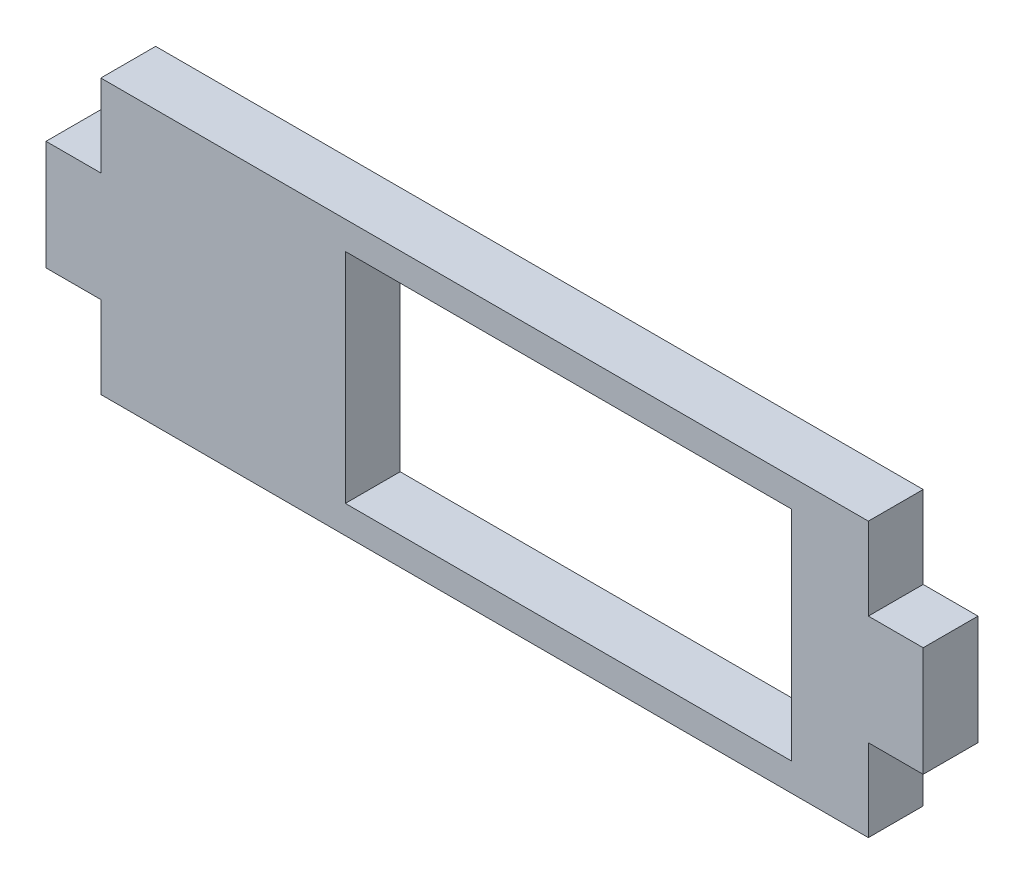
ISO-10303-21;
HEADER;
FILE_DESCRIPTION(('STEP AP214'),'2;1');
FILE_NAME('part.step','',(''),(''),'','','');
FILE_SCHEMA(('AUTOMOTIVE_DESIGN { 1 0 10303 214 1 1 1 1 }'));
ENDSEC;
DATA;
#1=APPLICATION_CONTEXT('core data for automotive mechanical design processes');
#2=APPLICATION_PROTOCOL_DEFINITION('international standard','automotive_design',2000,#1);
#3=PRODUCT_CONTEXT('',#1,'mechanical');
#4=PRODUCT('Part','Part','',(#3));
#5=PRODUCT_RELATED_PRODUCT_CATEGORY('part','',(#4));
#6=PRODUCT_DEFINITION_FORMATION('','',#4);
#7=PRODUCT_DEFINITION_CONTEXT('part definition',#1,'design');
#8=PRODUCT_DEFINITION('design','',#6,#7);
#9=PRODUCT_DEFINITION_SHAPE('','',#8);
#10=(LENGTH_UNIT() NAMED_UNIT(*) SI_UNIT(.MILLI.,.METRE.));
#11=(NAMED_UNIT(*) PLANE_ANGLE_UNIT() SI_UNIT($,.RADIAN.));
#12=(NAMED_UNIT(*) SI_UNIT($,.STERADIAN.) SOLID_ANGLE_UNIT());
#13=UNCERTAINTY_MEASURE_WITH_UNIT(LENGTH_MEASURE(1.E-05),#10,'distance_accuracy_value','');
#14=(GEOMETRIC_REPRESENTATION_CONTEXT(3) GLOBAL_UNCERTAINTY_ASSIGNED_CONTEXT((#13)) GLOBAL_UNIT_ASSIGNED_CONTEXT((#10,
#11,#12)) REPRESENTATION_CONTEXT('',''));
#15=CARTESIAN_POINT('',(0.,0.,0.));
#16=DIRECTION('',(0.,0.,1.));
#17=DIRECTION('',(1.,0.,0.));
#18=AXIS2_PLACEMENT_3D('',#15,#16,#17);
#19=CARTESIAN_POINT('',(35.,0.,5.));
#20=DIRECTION('',(1.,0.,0.));
#21=DIRECTION('',(0.,1.,0.));
#22=AXIS2_PLACEMENT_3D('',#19,#20,#21);
#23=PLANE('',#22);
#24=DIRECTION('',(0.,-1.,0.));
#25=VECTOR('',#24,1.);
#26=CARTESIAN_POINT('',(35.,0.,0.));
#27=LINE('',#26,#25);
#28=CARTESIAN_POINT('',(35.,-5.,0.));
#29=VERTEX_POINT('',#28);
#30=CARTESIAN_POINT('',(35.,-12.5,0.));
#31=VERTEX_POINT('',#30);
#32=EDGE_CURVE('E178',#29,#31,#27,.T.);
#33=ORIENTED_EDGE('',*,*,#32,.F.);
#34=DIRECTION('',(0.,0.,-1.));
#35=VECTOR('',#34,1.);
#36=CARTESIAN_POINT('',(35.,-5.,5.));
#37=LINE('',#36,#35);
#38=CARTESIAN_POINT('',(35.,-5.,5.));
#39=VERTEX_POINT('',#38);
#40=EDGE_CURVE('E11',#39,#29,#37,.T.);
#41=ORIENTED_EDGE('',*,*,#40,.F.);
#42=DIRECTION('',(0.,-1.,0.));
#43=VECTOR('',#42,1.);
#44=CARTESIAN_POINT('',(35.,0.,5.));
#45=LINE('',#44,#43);
#46=CARTESIAN_POINT('',(35.,-12.5,5.));
#47=VERTEX_POINT('',#46);
#48=EDGE_CURVE('E182',#39,#47,#45,.T.);
#49=ORIENTED_EDGE('',*,*,#48,.T.);
#50=DIRECTION('',(0.,0.,-1.));
#51=VECTOR('',#50,1.);
#52=CARTESIAN_POINT('',(35.,-12.5,5.));
#53=LINE('',#52,#51);
#54=EDGE_CURVE('E213',#47,#31,#53,.T.);
#55=ORIENTED_EDGE('',*,*,#54,.T.);
#56=EDGE_LOOP('',(#33,#41,#49,#55));
#57=FACE_BOUND('',#56,.T.);
#58=ADVANCED_FACE('F34',(#57),#23,.T.);
#59=CARTESIAN_POINT('',(0.,-5.00000000000001,5.));
#60=DIRECTION('',(0.,-1.,0.));
#61=DIRECTION('',(1.,0.,0.));
#62=AXIS2_PLACEMENT_3D('',#59,#60,#61);
#63=PLANE('',#62);
#64=DIRECTION('',(-1.,0.,0.));
#65=VECTOR('',#64,1.);
#66=CARTESIAN_POINT('',(0.,-5.00000000000001,0.));
#67=LINE('',#66,#65);
#68=CARTESIAN_POINT('',(40.,-5.,0.));
#69=VERTEX_POINT('',#68);
#70=EDGE_CURVE('E216',#69,#29,#67,.T.);
#71=ORIENTED_EDGE('',*,*,#70,.F.);
#72=DIRECTION('',(0.,0.,-1.));
#73=VECTOR('',#72,1.);
#74=CARTESIAN_POINT('',(40.,-5.,5.));
#75=LINE('',#74,#73);
#76=CARTESIAN_POINT('',(40.,-5.,5.));
#77=VERTEX_POINT('',#76);
#78=EDGE_CURVE('E41',#77,#69,#75,.T.);
#79=ORIENTED_EDGE('',*,*,#78,.F.);
#80=DIRECTION('',(-1.,0.,0.));
#81=VECTOR('',#80,1.);
#82=CARTESIAN_POINT('',(0.,-5.00000000000001,5.));
#83=LINE('',#82,#81);
#84=EDGE_CURVE('E185',#77,#39,#83,.T.);
#85=ORIENTED_EDGE('',*,*,#84,.T.);
#86=ORIENTED_EDGE('',*,*,#40,.T.);
#87=EDGE_LOOP('',(#71,#79,#85,#86));
#88=FACE_BOUND('',#87,.T.);
#89=ADVANCED_FACE('F273',(#88),#63,.T.);
#90=CARTESIAN_POINT('',(40.,0.,5.));
#91=DIRECTION('',(1.,0.,0.));
#92=DIRECTION('',(0.,0.,-1.));
#93=AXIS2_PLACEMENT_3D('',#90,#91,#92);
#94=PLANE('',#93);
#95=DIRECTION('',(0.,-1.,0.));
#96=VECTOR('',#95,1.);
#97=CARTESIAN_POINT('',(40.,0.,0.));
#98=LINE('',#97,#96);
#99=CARTESIAN_POINT('',(40.,5.,0.));
#100=VERTEX_POINT('',#99);
#101=EDGE_CURVE('E219',#100,#69,#98,.T.);
#102=ORIENTED_EDGE('',*,*,#101,.F.);
#103=DIRECTION('',(0.,0.,-1.));
#104=VECTOR('',#103,1.);
#105=CARTESIAN_POINT('',(40.,5.,5.));
#106=LINE('',#105,#104);
#107=CARTESIAN_POINT('',(40.,5.,5.));
#108=VERTEX_POINT('',#107);
#109=EDGE_CURVE('E265',#108,#100,#106,.T.);
#110=ORIENTED_EDGE('',*,*,#109,.F.);
#111=DIRECTION('',(0.,-1.,0.));
#112=VECTOR('',#111,1.);
#113=CARTESIAN_POINT('',(40.,0.,5.));
#114=LINE('',#113,#112);
#115=EDGE_CURVE('E189',#108,#77,#114,.T.);
#116=ORIENTED_EDGE('',*,*,#115,.T.);
#117=ORIENTED_EDGE('',*,*,#78,.T.);
#118=EDGE_LOOP('',(#102,#110,#116,#117));
#119=FACE_BOUND('',#118,.T.);
#120=ADVANCED_FACE('F269',(#119),#94,.T.);
#121=CARTESIAN_POINT('',(0.,5.,5.));
#122=DIRECTION('',(0.,-1.,0.));
#123=DIRECTION('',(0.,0.,-1.));
#124=AXIS2_PLACEMENT_3D('',#121,#122,#123);
#125=PLANE('',#124);
#126=DIRECTION('',(-1.,0.,0.));
#127=VECTOR('',#126,1.);
#128=CARTESIAN_POINT('',(0.,5.,0.));
#129=LINE('',#128,#127);
#130=CARTESIAN_POINT('',(35.,5.,0.));
#131=VERTEX_POINT('',#130);
#132=EDGE_CURVE('E222',#100,#131,#129,.T.);
#133=ORIENTED_EDGE('',*,*,#132,.T.);
#134=DIRECTION('',(0.,0.,-1.));
#135=VECTOR('',#134,1.);
#136=CARTESIAN_POINT('',(35.,5.,5.));
#137=LINE('',#136,#135);
#138=CARTESIAN_POINT('',(35.,5.,5.));
#139=VERTEX_POINT('',#138);
#140=EDGE_CURVE('E263',#139,#131,#137,.T.);
#141=ORIENTED_EDGE('',*,*,#140,.F.);
#142=DIRECTION('',(-1.,0.,0.));
#143=VECTOR('',#142,1.);
#144=CARTESIAN_POINT('',(0.,5.,5.));
#145=LINE('',#144,#143);
#146=EDGE_CURVE('E192',#108,#139,#145,.T.);
#147=ORIENTED_EDGE('',*,*,#146,.F.);
#148=ORIENTED_EDGE('',*,*,#109,.T.);
#149=EDGE_LOOP('',(#133,#141,#147,#148));
#150=FACE_BOUND('',#149,.T.);
#151=ADVANCED_FACE('F279',(#150),#125,.F.);
#152=CARTESIAN_POINT('',(35.,0.,5.));
#153=DIRECTION('',(1.,0.,0.));
#154=DIRECTION('',(0.,1.,0.));
#155=AXIS2_PLACEMENT_3D('',#152,#153,#154);
#156=PLANE('',#155);
#157=DIRECTION('',(0.,-1.,0.));
#158=VECTOR('',#157,1.);
#159=CARTESIAN_POINT('',(35.,0.,0.));
#160=LINE('',#159,#158);
#161=CARTESIAN_POINT('',(35.,12.5,0.));
#162=VERTEX_POINT('',#161);
#163=EDGE_CURVE('E225',#162,#131,#160,.T.);
#164=ORIENTED_EDGE('',*,*,#163,.F.);
#165=DIRECTION('',(0.,0.,-1.));
#166=VECTOR('',#165,1.);
#167=CARTESIAN_POINT('',(35.,12.5,5.));
#168=LINE('',#167,#166);
#169=CARTESIAN_POINT('',(35.,12.5,5.));
#170=VERTEX_POINT('',#169);
#171=EDGE_CURVE('E261',#170,#162,#168,.T.);
#172=ORIENTED_EDGE('',*,*,#171,.F.);
#173=DIRECTION('',(0.,-1.,0.));
#174=VECTOR('',#173,1.);
#175=CARTESIAN_POINT('',(35.,0.,5.));
#176=LINE('',#175,#174);
#177=EDGE_CURVE('E194',#170,#139,#176,.T.);
#178=ORIENTED_EDGE('',*,*,#177,.T.);
#179=ORIENTED_EDGE('',*,*,#140,.T.);
#180=EDGE_LOOP('',(#164,#172,#178,#179));
#181=FACE_BOUND('',#180,.T.);
#182=ADVANCED_FACE('F319',(#181),#156,.T.);
#183=CARTESIAN_POINT('',(0.,12.5,5.));
#184=DIRECTION('',(0.,1.,0.));
#185=DIRECTION('',(0.,0.,1.));
#186=AXIS2_PLACEMENT_3D('',#183,#184,#185);
#187=PLANE('',#186);
#188=DIRECTION('',(1.,0.,0.));
#189=VECTOR('',#188,1.);
#190=CARTESIAN_POINT('',(0.,12.5,0.));
#191=LINE('',#190,#189);
#192=CARTESIAN_POINT('',(-35.,12.5,0.));
#193=VERTEX_POINT('',#192);
#194=EDGE_CURVE('E228',#193,#162,#191,.T.);
#195=ORIENTED_EDGE('',*,*,#194,.F.);
#196=DIRECTION('',(0.,0.,-1.));
#197=VECTOR('',#196,1.);
#198=CARTESIAN_POINT('',(-35.,12.5,5.));
#199=LINE('',#198,#197);
#200=CARTESIAN_POINT('',(-35.,12.5,5.));
#201=VERTEX_POINT('',#200);
#202=EDGE_CURVE('E259',#201,#193,#199,.T.);
#203=ORIENTED_EDGE('',*,*,#202,.F.);
#204=DIRECTION('',(1.,0.,0.));
#205=VECTOR('',#204,1.);
#206=CARTESIAN_POINT('',(0.,12.5,5.));
#207=LINE('',#206,#205);
#208=EDGE_CURVE('E197',#201,#170,#207,.T.);
#209=ORIENTED_EDGE('',*,*,#208,.T.);
#210=ORIENTED_EDGE('',*,*,#171,.T.);
#211=EDGE_LOOP('',(#195,#203,#209,#210));
#212=FACE_BOUND('',#211,.T.);
#213=ADVANCED_FACE('F316',(#212),#187,.T.);
#214=CARTESIAN_POINT('',(-35.,0.,5.));
#215=DIRECTION('',(1.,0.,0.));
#216=DIRECTION('',(0.,0.,-1.));
#217=AXIS2_PLACEMENT_3D('',#214,#215,#216);
#218=PLANE('',#217);
#219=DIRECTION('',(0.,-1.,0.));
#220=VECTOR('',#219,1.);
#221=CARTESIAN_POINT('',(-35.,0.,0.));
#222=LINE('',#221,#220);
#223=CARTESIAN_POINT('',(-35.,5.,0.));
#224=VERTEX_POINT('',#223);
#225=EDGE_CURVE('E231',#193,#224,#222,.T.);
#226=ORIENTED_EDGE('',*,*,#225,.T.);
#227=DIRECTION('',(0.,0.,-1.));
#228=VECTOR('',#227,1.);
#229=CARTESIAN_POINT('',(-35.,5.,5.));
#230=LINE('',#229,#228);
#231=CARTESIAN_POINT('',(-35.,5.,5.));
#232=VERTEX_POINT('',#231);
#233=EDGE_CURVE('E257',#232,#224,#230,.T.);
#234=ORIENTED_EDGE('',*,*,#233,.F.);
#235=DIRECTION('',(0.,-1.,0.));
#236=VECTOR('',#235,1.);
#237=CARTESIAN_POINT('',(-35.,0.,5.));
#238=LINE('',#237,#236);
#239=EDGE_CURVE('E200',#201,#232,#238,.T.);
#240=ORIENTED_EDGE('',*,*,#239,.F.);
#241=ORIENTED_EDGE('',*,*,#202,.T.);
#242=EDGE_LOOP('',(#226,#234,#240,#241));
#243=FACE_BOUND('',#242,.T.);
#244=ADVANCED_FACE('F313',(#243),#218,.F.);
#245=CARTESIAN_POINT('',(0.,5.,5.));
#246=DIRECTION('',(0.,1.,0.));
#247=DIRECTION('',(0.,0.,1.));
#248=AXIS2_PLACEMENT_3D('',#245,#246,#247);
#249=PLANE('',#248);
#250=DIRECTION('',(1.,0.,0.));
#251=VECTOR('',#250,1.);
#252=CARTESIAN_POINT('',(0.,5.,0.));
#253=LINE('',#252,#251);
#254=CARTESIAN_POINT('',(-40.,5.,0.));
#255=VERTEX_POINT('',#254);
#256=EDGE_CURVE('E234',#255,#224,#253,.T.);
#257=ORIENTED_EDGE('',*,*,#256,.F.);
#258=DIRECTION('',(0.,0.,-1.));
#259=VECTOR('',#258,1.);
#260=CARTESIAN_POINT('',(-40.,5.,5.));
#261=LINE('',#260,#259);
#262=CARTESIAN_POINT('',(-40.,5.,5.));
#263=VERTEX_POINT('',#262);
#264=EDGE_CURVE('E255',#263,#255,#261,.T.);
#265=ORIENTED_EDGE('',*,*,#264,.F.);
#266=DIRECTION('',(1.,0.,0.));
#267=VECTOR('',#266,1.);
#268=CARTESIAN_POINT('',(0.,5.,5.));
#269=LINE('',#268,#267);
#270=EDGE_CURVE('E202',#263,#232,#269,.T.);
#271=ORIENTED_EDGE('',*,*,#270,.T.);
#272=ORIENTED_EDGE('',*,*,#233,.T.);
#273=EDGE_LOOP('',(#257,#265,#271,#272));
#274=FACE_BOUND('',#273,.T.);
#275=ADVANCED_FACE('F307',(#274),#249,.T.);
#276=CARTESIAN_POINT('',(-40.,0.,5.));
#277=DIRECTION('',(1.,0.,0.));
#278=DIRECTION('',(0.,0.,-1.));
#279=AXIS2_PLACEMENT_3D('',#276,#277,#278);
#280=PLANE('',#279);
#281=DIRECTION('',(0.,-1.,0.));
#282=VECTOR('',#281,1.);
#283=CARTESIAN_POINT('',(-40.,0.,0.));
#284=LINE('',#283,#282);
#285=CARTESIAN_POINT('',(-40.,-5.,0.));
#286=VERTEX_POINT('',#285);
#287=EDGE_CURVE('E237',#255,#286,#284,.T.);
#288=ORIENTED_EDGE('',*,*,#287,.T.);
#289=DIRECTION('',(0.,0.,-1.));
#290=VECTOR('',#289,1.);
#291=CARTESIAN_POINT('',(-40.,-5.,5.));
#292=LINE('',#291,#290);
#293=CARTESIAN_POINT('',(-40.,-5.,5.));
#294=VERTEX_POINT('',#293);
#295=EDGE_CURVE('E252',#294,#286,#292,.T.);
#296=ORIENTED_EDGE('',*,*,#295,.F.);
#297=DIRECTION('',(0.,-1.,0.));
#298=VECTOR('',#297,1.);
#299=CARTESIAN_POINT('',(-40.,0.,5.));
#300=LINE('',#299,#298);
#301=EDGE_CURVE('E205',#263,#294,#300,.T.);
#302=ORIENTED_EDGE('',*,*,#301,.F.);
#303=ORIENTED_EDGE('',*,*,#264,.T.);
#304=EDGE_LOOP('',(#288,#296,#302,#303));
#305=FACE_BOUND('',#304,.T.);
#306=ADVANCED_FACE('F320',(#305),#280,.F.);
#307=CARTESIAN_POINT('',(0.,-5.00000000000001,5.));
#308=DIRECTION('',(0.,1.,0.));
#309=DIRECTION('',(-1.,0.,0.));
#310=AXIS2_PLACEMENT_3D('',#307,#308,#309);
#311=PLANE('',#310);
#312=DIRECTION('',(1.,0.,0.));
#313=VECTOR('',#312,1.);
#314=CARTESIAN_POINT('',(0.,-5.00000000000001,0.));
#315=LINE('',#314,#313);
#316=CARTESIAN_POINT('',(-35.,-5.,0.));
#317=VERTEX_POINT('',#316);
#318=EDGE_CURVE('E239',#286,#317,#315,.T.);
#319=ORIENTED_EDGE('',*,*,#318,.T.);
#320=DIRECTION('',(0.,0.,-1.));
#321=VECTOR('',#320,1.);
#322=CARTESIAN_POINT('',(-35.,-5.,5.));
#323=LINE('',#322,#321);
#324=CARTESIAN_POINT('',(-35.,-5.,5.));
#325=VERTEX_POINT('',#324);
#326=EDGE_CURVE('E249',#325,#317,#323,.T.);
#327=ORIENTED_EDGE('',*,*,#326,.F.);
#328=DIRECTION('',(1.,0.,0.));
#329=VECTOR('',#328,1.);
#330=CARTESIAN_POINT('',(0.,-5.00000000000001,5.));
#331=LINE('',#330,#329);
#332=EDGE_CURVE('E207',#294,#325,#331,.T.);
#333=ORIENTED_EDGE('',*,*,#332,.F.);
#334=ORIENTED_EDGE('',*,*,#295,.T.);
#335=EDGE_LOOP('',(#319,#327,#333,#334));
#336=FACE_BOUND('',#335,.T.);
#337=ADVANCED_FACE('F300',(#336),#311,.F.);
#338=CARTESIAN_POINT('',(-35.,0.,5.));
#339=DIRECTION('',(1.,0.,0.));
#340=DIRECTION('',(0.,0.,-1.));
#341=AXIS2_PLACEMENT_3D('',#338,#339,#340);
#342=PLANE('',#341);
#343=DIRECTION('',(0.,-1.,0.));
#344=VECTOR('',#343,1.);
#345=CARTESIAN_POINT('',(-35.,0.,0.));
#346=LINE('',#345,#344);
#347=CARTESIAN_POINT('',(-35.,-12.5,0.));
#348=VERTEX_POINT('',#347);
#349=EDGE_CURVE('E241',#317,#348,#346,.T.);
#350=ORIENTED_EDGE('',*,*,#349,.T.);
#351=DIRECTION('',(0.,0.,-1.));
#352=VECTOR('',#351,1.);
#353=CARTESIAN_POINT('',(-35.,-12.5,5.));
#354=LINE('',#353,#352);
#355=CARTESIAN_POINT('',(-35.,-12.5,5.));
#356=VERTEX_POINT('',#355);
#357=EDGE_CURVE('E246',#356,#348,#354,.T.);
#358=ORIENTED_EDGE('',*,*,#357,.F.);
#359=DIRECTION('',(0.,-1.,0.));
#360=VECTOR('',#359,1.);
#361=CARTESIAN_POINT('',(-35.,0.,5.));
#362=LINE('',#361,#360);
#363=EDGE_CURVE('E209',#325,#356,#362,.T.);
#364=ORIENTED_EDGE('',*,*,#363,.F.);
#365=ORIENTED_EDGE('',*,*,#326,.T.);
#366=EDGE_LOOP('',(#350,#358,#364,#365));
#367=FACE_BOUND('',#366,.T.);
#368=ADVANCED_FACE('F296',(#367),#342,.F.);
#369=CARTESIAN_POINT('',(0.,-12.5,5.));
#370=DIRECTION('',(0.,1.,0.));
#371=DIRECTION('',(0.,0.,1.));
#372=AXIS2_PLACEMENT_3D('',#369,#370,#371);
#373=PLANE('',#372);
#374=DIRECTION('',(1.,0.,0.));
#375=VECTOR('',#374,1.);
#376=CARTESIAN_POINT('',(0.,-12.5,0.));
#377=LINE('',#376,#375);
#378=EDGE_CURVE('E186',#348,#31,#377,.T.);
#379=ORIENTED_EDGE('',*,*,#378,.T.);
#380=ORIENTED_EDGE('',*,*,#54,.F.);
#381=DIRECTION('',(1.,0.,0.));
#382=VECTOR('',#381,1.);
#383=CARTESIAN_POINT('',(0.,-12.5,5.));
#384=LINE('',#383,#382);
#385=EDGE_CURVE('E211',#356,#47,#384,.T.);
#386=ORIENTED_EDGE('',*,*,#385,.F.);
#387=ORIENTED_EDGE('',*,*,#357,.T.);
#388=EDGE_LOOP('',(#379,#380,#386,#387));
#389=FACE_BOUND('',#388,.T.);
#390=ADVANCED_FACE('F292',(#389),#373,.F.);
#391=CARTESIAN_POINT('',(0.,0.,5.));
#392=DIRECTION('',(0.,0.,1.));
#393=DIRECTION('',(1.,0.,0.));
#394=AXIS2_PLACEMENT_3D('',#391,#392,#393);
#395=PLANE('',#394);
#396=DIRECTION('',(0.,-1.,0.));
#397=VECTOR('',#396,1.);
#398=CARTESIAN_POINT('',(-12.7,-9.95,5.));
#399=LINE('',#398,#397);
#400=CARTESIAN_POINT('',(-12.7,9.95,5.));
#401=VERTEX_POINT('',#400);
#402=CARTESIAN_POINT('',(-12.7,-9.95,5.));
#403=VERTEX_POINT('',#402);
#404=EDGE_CURVE('E48',#401,#403,#399,.T.);
#405=ORIENTED_EDGE('',*,*,#404,.F.);
#406=DIRECTION('',(-1.,0.,0.));
#407=VECTOR('',#406,1.);
#408=CARTESIAN_POINT('',(-12.7,9.95,5.));
#409=LINE('',#408,#407);
#410=CARTESIAN_POINT('',(28.,9.95,5.));
#411=VERTEX_POINT('',#410);
#412=EDGE_CURVE('E163',#411,#401,#409,.T.);
#413=ORIENTED_EDGE('',*,*,#412,.F.);
#414=DIRECTION('',(0.,1.,0.));
#415=VECTOR('',#414,1.);
#416=CARTESIAN_POINT('',(28.,9.95,5.));
#417=LINE('',#416,#415);
#418=CARTESIAN_POINT('',(28.,-9.95,5.));
#419=VERTEX_POINT('',#418);
#420=EDGE_CURVE('E166',#419,#411,#417,.T.);
#421=ORIENTED_EDGE('',*,*,#420,.F.);
#422=DIRECTION('',(1.,0.,0.));
#423=VECTOR('',#422,1.);
#424=CARTESIAN_POINT('',(28.,-9.95,5.));
#425=LINE('',#424,#423);
#426=EDGE_CURVE('E172',#403,#419,#425,.T.);
#427=ORIENTED_EDGE('',*,*,#426,.F.);
#428=EDGE_LOOP('',(#405,#413,#421,#427));
#429=FACE_BOUND('',#428,.T.);
#430=ORIENTED_EDGE('',*,*,#48,.F.);
#431=ORIENTED_EDGE('',*,*,#84,.F.);
#432=ORIENTED_EDGE('',*,*,#115,.F.);
#433=ORIENTED_EDGE('',*,*,#146,.T.);
#434=ORIENTED_EDGE('',*,*,#177,.F.);
#435=ORIENTED_EDGE('',*,*,#208,.F.);
#436=ORIENTED_EDGE('',*,*,#239,.T.);
#437=ORIENTED_EDGE('',*,*,#270,.F.);
#438=ORIENTED_EDGE('',*,*,#301,.T.);
#439=ORIENTED_EDGE('',*,*,#332,.T.);
#440=ORIENTED_EDGE('',*,*,#363,.T.);
#441=ORIENTED_EDGE('',*,*,#385,.T.);
#442=EDGE_LOOP('',(#430,#431,#432,#433,#434,#435,#436,#437,#438,#439,#440,#441));
#443=FACE_BOUND('',#442,.T.);
#444=ADVANCED_FACE('F284',(#429,#443),#395,.T.);
#445=CARTESIAN_POINT('',(0.,0.,0.));
#446=DIRECTION('',(0.,0.,1.));
#447=DIRECTION('',(1.,0.,0.));
#448=AXIS2_PLACEMENT_3D('',#445,#446,#447);
#449=PLANE('',#448);
#450=DIRECTION('',(-1.,0.,0.));
#451=VECTOR('',#450,1.);
#452=CARTESIAN_POINT('',(-12.7,9.95,0.));
#453=LINE('',#452,#451);
#454=CARTESIAN_POINT('',(28.,9.95,0.));
#455=VERTEX_POINT('',#454);
#456=CARTESIAN_POINT('',(-12.7,9.95,0.));
#457=VERTEX_POINT('',#456);
#458=EDGE_CURVE('E153',#455,#457,#453,.T.);
#459=ORIENTED_EDGE('',*,*,#458,.T.);
#460=DIRECTION('',(0.,-1.,0.));
#461=VECTOR('',#460,1.);
#462=CARTESIAN_POINT('',(-12.7,-9.95,0.));
#463=LINE('',#462,#461);
#464=CARTESIAN_POINT('',(-12.7,-9.95,0.));
#465=VERTEX_POINT('',#464);
#466=EDGE_CURVE('E147',#457,#465,#463,.T.);
#467=ORIENTED_EDGE('',*,*,#466,.T.);
#468=DIRECTION('',(1.,0.,0.));
#469=VECTOR('',#468,1.);
#470=CARTESIAN_POINT('',(28.,-9.95,0.));
#471=LINE('',#470,#469);
#472=CARTESIAN_POINT('',(28.,-9.95,0.));
#473=VERTEX_POINT('',#472);
#474=EDGE_CURVE('E156',#465,#473,#471,.T.);
#475=ORIENTED_EDGE('',*,*,#474,.T.);
#476=DIRECTION('',(0.,1.,0.));
#477=VECTOR('',#476,1.);
#478=CARTESIAN_POINT('',(28.,9.95,0.));
#479=LINE('',#478,#477);
#480=EDGE_CURVE('E56',#473,#455,#479,.T.);
#481=ORIENTED_EDGE('',*,*,#480,.T.);
#482=EDGE_LOOP('',(#459,#467,#475,#481));
#483=FACE_BOUND('',#482,.T.);
#484=ORIENTED_EDGE('',*,*,#32,.T.);
#485=ORIENTED_EDGE('',*,*,#378,.F.);
#486=ORIENTED_EDGE('',*,*,#349,.F.);
#487=ORIENTED_EDGE('',*,*,#318,.F.);
#488=ORIENTED_EDGE('',*,*,#287,.F.);
#489=ORIENTED_EDGE('',*,*,#256,.T.);
#490=ORIENTED_EDGE('',*,*,#225,.F.);
#491=ORIENTED_EDGE('',*,*,#194,.T.);
#492=ORIENTED_EDGE('',*,*,#163,.T.);
#493=ORIENTED_EDGE('',*,*,#132,.F.);
#494=ORIENTED_EDGE('',*,*,#101,.T.);
#495=ORIENTED_EDGE('',*,*,#70,.T.);
#496=EDGE_LOOP('',(#484,#485,#486,#487,#488,#489,#490,#491,#492,#493,#494,#495));
#497=FACE_BOUND('',#496,.T.);
#498=ADVANCED_FACE('F160',(#483,#497),#449,.F.);
#499=CARTESIAN_POINT('',(-12.7,-9.95,0.));
#500=DIRECTION('',(-1.,0.,0.));
#501=DIRECTION('',(0.,0.,1.));
#502=AXIS2_PLACEMENT_3D('',#499,#500,#501);
#503=PLANE('',#502);
#504=ORIENTED_EDGE('',*,*,#404,.T.);
#505=DIRECTION('',(0.,0.,1.));
#506=VECTOR('',#505,1.);
#507=CARTESIAN_POINT('',(-12.7,-9.95,0.));
#508=LINE('',#507,#506);
#509=EDGE_CURVE('E143',#465,#403,#508,.T.);
#510=ORIENTED_EDGE('',*,*,#509,.F.);
#511=ORIENTED_EDGE('',*,*,#466,.F.);
#512=DIRECTION('',(0.,0.,1.));
#513=VECTOR('',#512,1.);
#514=CARTESIAN_POINT('',(-12.7,9.95,0.));
#515=LINE('',#514,#513);
#516=EDGE_CURVE('E176',#457,#401,#515,.T.);
#517=ORIENTED_EDGE('',*,*,#516,.T.);
#518=EDGE_LOOP('',(#504,#510,#511,#517));
#519=FACE_BOUND('',#518,.T.);
#520=ADVANCED_FACE('F145',(#519),#503,.F.);
#521=CARTESIAN_POINT('',(-12.7,9.95,0.));
#522=DIRECTION('',(0.,1.,0.));
#523=DIRECTION('',(0.,0.,1.));
#524=AXIS2_PLACEMENT_3D('',#521,#522,#523);
#525=PLANE('',#524);
#526=ORIENTED_EDGE('',*,*,#412,.T.);
#527=ORIENTED_EDGE('',*,*,#516,.F.);
#528=ORIENTED_EDGE('',*,*,#458,.F.);
#529=DIRECTION('',(0.,0.,1.));
#530=VECTOR('',#529,1.);
#531=CARTESIAN_POINT('',(28.,9.95,0.));
#532=LINE('',#531,#530);
#533=EDGE_CURVE('E179',#455,#411,#532,.T.);
#534=ORIENTED_EDGE('',*,*,#533,.T.);
#535=EDGE_LOOP('',(#526,#527,#528,#534));
#536=FACE_BOUND('',#535,.T.);
#537=ADVANCED_FACE('F405',(#536),#525,.F.);
#538=CARTESIAN_POINT('',(28.,9.95,0.));
#539=DIRECTION('',(1.,0.,0.));
#540=DIRECTION('',(0.,0.,-1.));
#541=AXIS2_PLACEMENT_3D('',#538,#539,#540);
#542=PLANE('',#541);
#543=ORIENTED_EDGE('',*,*,#420,.T.);
#544=ORIENTED_EDGE('',*,*,#533,.F.);
#545=ORIENTED_EDGE('',*,*,#480,.F.);
#546=DIRECTION('',(0.,0.,1.));
#547=VECTOR('',#546,1.);
#548=CARTESIAN_POINT('',(28.,-9.95,0.));
#549=LINE('',#548,#547);
#550=EDGE_CURVE('E152',#473,#419,#549,.T.);
#551=ORIENTED_EDGE('',*,*,#550,.T.);
#552=EDGE_LOOP('',(#543,#544,#545,#551));
#553=FACE_BOUND('',#552,.T.);
#554=ADVANCED_FACE('F414',(#553),#542,.F.);
#555=CARTESIAN_POINT('',(28.,-9.95,0.));
#556=DIRECTION('',(0.,-1.,0.));
#557=DIRECTION('',(1.,0.,0.));
#558=AXIS2_PLACEMENT_3D('',#555,#556,#557);
#559=PLANE('',#558);
#560=ORIENTED_EDGE('',*,*,#426,.T.);
#561=ORIENTED_EDGE('',*,*,#550,.F.);
#562=ORIENTED_EDGE('',*,*,#474,.F.);
#563=ORIENTED_EDGE('',*,*,#509,.T.);
#564=EDGE_LOOP('',(#560,#561,#562,#563));
#565=FACE_BOUND('',#564,.T.);
#566=ADVANCED_FACE('F157',(#565),#559,.F.);
#567=CLOSED_SHELL('',(#58,#89,#120,#151,#182,#213,#244,#275,#306,#337,#368,#390,#444,#498,#520,
#537,#554,#566));
#568=MANIFOLD_SOLID_BREP('B2',#567);
#569=ADVANCED_BREP_SHAPE_REPRESENTATION('',(#18,#568),#14);
#570=SHAPE_DEFINITION_REPRESENTATION(#9,#569);
ENDSEC;
END-ISO-10303-21;
